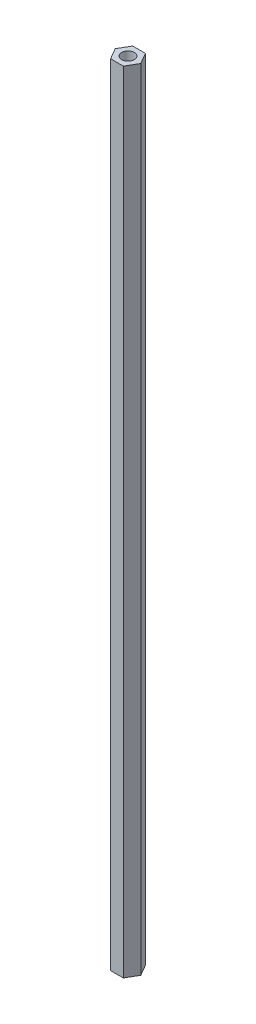
ISO-10303-21;
HEADER;
FILE_DESCRIPTION(('STEP AP214'),'2;1');
FILE_NAME('part.step','',(''),(''),'','','');
FILE_SCHEMA(('AUTOMOTIVE_DESIGN { 1 0 10303 214 1 1 1 1 }'));
ENDSEC;
DATA;
#1=APPLICATION_CONTEXT('core data for automotive mechanical design processes');
#2=APPLICATION_PROTOCOL_DEFINITION('international standard','automotive_design',2000,#1);
#3=PRODUCT_CONTEXT('',#1,'mechanical');
#4=PRODUCT('Part','Part','',(#3));
#5=PRODUCT_RELATED_PRODUCT_CATEGORY('part','',(#4));
#6=PRODUCT_DEFINITION_FORMATION('','',#4);
#7=PRODUCT_DEFINITION_CONTEXT('part definition',#1,'design');
#8=PRODUCT_DEFINITION('design','',#6,#7);
#9=PRODUCT_DEFINITION_SHAPE('','',#8);
#10=(LENGTH_UNIT() NAMED_UNIT(*) SI_UNIT(.MILLI.,.METRE.));
#11=(NAMED_UNIT(*) PLANE_ANGLE_UNIT() SI_UNIT($,.RADIAN.));
#12=(NAMED_UNIT(*) SI_UNIT($,.STERADIAN.) SOLID_ANGLE_UNIT());
#13=UNCERTAINTY_MEASURE_WITH_UNIT(LENGTH_MEASURE(1.E-05),#10,'distance_accuracy_value','');
#14=(GEOMETRIC_REPRESENTATION_CONTEXT(3) GLOBAL_UNCERTAINTY_ASSIGNED_CONTEXT((#13)) GLOBAL_UNIT_ASSIGNED_CONTEXT((#10,
#11,#12)) REPRESENTATION_CONTEXT('',''));
#15=CARTESIAN_POINT('',(0.,0.,0.));
#16=DIRECTION('',(0.,0.,1.));
#17=DIRECTION('',(1.,0.,0.));
#18=AXIS2_PLACEMENT_3D('',#15,#16,#17);
#19=CARTESIAN_POINT('',(0.,250.,0.));
#20=DIRECTION('',(0.,1.,0.));
#21=DIRECTION('',(0.,0.,1.));
#22=AXIS2_PLACEMENT_3D('',#19,#20,#21);
#23=PLANE('',#22);
#24=DIRECTION('',(-0.5,0.,-0.866025403784438));
#25=VECTOR('',#24,1.);
#26=CARTESIAN_POINT('',(4.04145188432738,250.,0.));
#27=LINE('',#26,#25);
#28=CARTESIAN_POINT('',(4.04145188432738,250.,0.));
#29=VERTEX_POINT('',#28);
#30=CARTESIAN_POINT('',(2.02072594216369,250.,-3.5));
#31=VERTEX_POINT('',#30);
#32=EDGE_CURVE('E154',#29,#31,#27,.T.);
#33=ORIENTED_EDGE('',*,*,#32,.T.);
#34=DIRECTION('',(-1.,0.,0.));
#35=VECTOR('',#34,1.);
#36=CARTESIAN_POINT('',(2.02072594216369,250.,-3.5));
#37=LINE('',#36,#35);
#38=CARTESIAN_POINT('',(-2.02072594216369,250.,-3.5));
#39=VERTEX_POINT('',#38);
#40=EDGE_CURVE('E102',#31,#39,#37,.T.);
#41=ORIENTED_EDGE('',*,*,#40,.T.);
#42=DIRECTION('',(-0.5,0.,0.866025403784439));
#43=VECTOR('',#42,1.);
#44=CARTESIAN_POINT('',(-2.02072594216369,250.,-3.5));
#45=LINE('',#44,#43);
#46=CARTESIAN_POINT('',(-4.04145188432738,250.,0.));
#47=VERTEX_POINT('',#46);
#48=EDGE_CURVE('E115',#39,#47,#45,.T.);
#49=ORIENTED_EDGE('',*,*,#48,.T.);
#50=DIRECTION('',(0.5,0.,0.866025403784439));
#51=VECTOR('',#50,1.);
#52=CARTESIAN_POINT('',(-4.04145188432738,250.,0.));
#53=LINE('',#52,#51);
#54=CARTESIAN_POINT('',(-2.02072594216368,250.,3.5));
#55=VERTEX_POINT('',#54);
#56=EDGE_CURVE('E109',#47,#55,#53,.T.);
#57=ORIENTED_EDGE('',*,*,#56,.T.);
#58=DIRECTION('',(1.,0.,0.));
#59=VECTOR('',#58,1.);
#60=CARTESIAN_POINT('',(-2.02072594216368,250.,3.5));
#61=LINE('',#60,#59);
#62=CARTESIAN_POINT('',(2.02072594216369,250.,3.5));
#63=VERTEX_POINT('',#62);
#64=EDGE_CURVE('E113',#55,#63,#61,.T.);
#65=ORIENTED_EDGE('',*,*,#64,.T.);
#66=DIRECTION('',(0.5,0.,-0.866025403784439));
#67=VECTOR('',#66,1.);
#68=CARTESIAN_POINT('',(2.02072594216369,250.,3.5));
#69=LINE('',#68,#67);
#70=EDGE_CURVE('E65',#63,#29,#69,.T.);
#71=ORIENTED_EDGE('',*,*,#70,.T.);
#72=EDGE_LOOP('',(#33,#41,#49,#57,#65,#71));
#73=FACE_BOUND('',#72,.T.);
#74=CARTESIAN_POINT('',(0.,250.,0.));
#75=DIRECTION('',(0.,1.,0.));
#76=DIRECTION('',(0.,0.,1.));
#77=AXIS2_PLACEMENT_3D('',#74,#75,#76);
#78=CIRCLE('',#77,2.);
#79=CARTESIAN_POINT('',(0.,250.,2.));
#80=VERTEX_POINT('',#79);
#81=EDGE_CURVE('E142',#80,#80,#78,.T.);
#82=ORIENTED_EDGE('',*,*,#81,.F.);
#83=EDGE_LOOP('',(#82));
#84=FACE_BOUND('',#83,.T.);
#85=ADVANCED_FACE('F47',(#73,#84),#23,.T.);
#86=CARTESIAN_POINT('',(0.,0.,0.));
#87=DIRECTION('',(0.,1.,0.));
#88=DIRECTION('',(0.,0.,1.));
#89=AXIS2_PLACEMENT_3D('',#86,#87,#88);
#90=PLANE('',#89);
#91=DIRECTION('',(-0.5,0.,-0.866025403784438));
#92=VECTOR('',#91,1.);
#93=CARTESIAN_POINT('',(4.04145188432738,0.,0.));
#94=LINE('',#93,#92);
#95=CARTESIAN_POINT('',(4.04145188432738,0.,0.));
#96=VERTEX_POINT('',#95);
#97=CARTESIAN_POINT('',(2.02072594216369,0.,-3.5));
#98=VERTEX_POINT('',#97);
#99=EDGE_CURVE('E137',#96,#98,#94,.T.);
#100=ORIENTED_EDGE('',*,*,#99,.F.);
#101=DIRECTION('',(0.5,0.,-0.866025403784439));
#102=VECTOR('',#101,1.);
#103=CARTESIAN_POINT('',(2.02072594216369,0.,3.5));
#104=LINE('',#103,#102);
#105=CARTESIAN_POINT('',(2.02072594216369,0.,3.5));
#106=VERTEX_POINT('',#105);
#107=EDGE_CURVE('E94',#106,#96,#104,.T.);
#108=ORIENTED_EDGE('',*,*,#107,.F.);
#109=DIRECTION('',(1.,0.,0.));
#110=VECTOR('',#109,1.);
#111=CARTESIAN_POINT('',(-2.02072594216368,0.,3.5));
#112=LINE('',#111,#110);
#113=CARTESIAN_POINT('',(-2.02072594216368,0.,3.5));
#114=VERTEX_POINT('',#113);
#115=EDGE_CURVE('E88',#114,#106,#112,.T.);
#116=ORIENTED_EDGE('',*,*,#115,.F.);
#117=DIRECTION('',(0.5,0.,0.866025403784439));
#118=VECTOR('',#117,1.);
#119=CARTESIAN_POINT('',(-4.04145188432738,0.,0.));
#120=LINE('',#119,#118);
#121=CARTESIAN_POINT('',(-4.04145188432738,0.,0.));
#122=VERTEX_POINT('',#121);
#123=EDGE_CURVE('E124',#122,#114,#120,.T.);
#124=ORIENTED_EDGE('',*,*,#123,.F.);
#125=DIRECTION('',(-0.5,0.,0.866025403784439));
#126=VECTOR('',#125,1.);
#127=CARTESIAN_POINT('',(-2.02072594216369,0.,-3.5));
#128=LINE('',#127,#126);
#129=CARTESIAN_POINT('',(-2.02072594216369,0.,-3.5));
#130=VERTEX_POINT('',#129);
#131=EDGE_CURVE('E145',#130,#122,#128,.T.);
#132=ORIENTED_EDGE('',*,*,#131,.F.);
#133=DIRECTION('',(-1.,0.,0.));
#134=VECTOR('',#133,1.);
#135=CARTESIAN_POINT('',(2.02072594216369,0.,-3.5));
#136=LINE('',#135,#134);
#137=EDGE_CURVE('E141',#98,#130,#136,.T.);
#138=ORIENTED_EDGE('',*,*,#137,.F.);
#139=EDGE_LOOP('',(#100,#108,#116,#124,#132,#138));
#140=FACE_BOUND('',#139,.T.);
#141=CARTESIAN_POINT('',(0.,0.,0.));
#142=DIRECTION('',(0.,1.,0.));
#143=DIRECTION('',(0.,0.,1.));
#144=AXIS2_PLACEMENT_3D('',#141,#142,#143);
#145=CIRCLE('',#144,2.);
#146=CARTESIAN_POINT('',(0.,0.,2.));
#147=VERTEX_POINT('',#146);
#148=EDGE_CURVE('E253',#147,#147,#145,.T.);
#149=ORIENTED_EDGE('',*,*,#148,.T.);
#150=EDGE_LOOP('',(#149));
#151=FACE_BOUND('',#150,.T.);
#152=ADVANCED_FACE('F167',(#140,#151),#90,.F.);
#153=CARTESIAN_POINT('',(4.04145188432738,250.,0.));
#154=DIRECTION('',(-0.866025403784438,0.,0.5));
#155=DIRECTION('',(0.5,0.,0.866025403784438));
#156=AXIS2_PLACEMENT_3D('',#153,#154,#155);
#157=PLANE('',#156);
#158=ORIENTED_EDGE('',*,*,#99,.T.);
#159=DIRECTION('',(0.,-1.,0.));
#160=VECTOR('',#159,1.);
#161=CARTESIAN_POINT('',(2.02072594216369,250.,-3.5));
#162=LINE('',#161,#160);
#163=EDGE_CURVE('E11',#31,#98,#162,.T.);
#164=ORIENTED_EDGE('',*,*,#163,.F.);
#165=ORIENTED_EDGE('',*,*,#32,.F.);
#166=DIRECTION('',(0.,-1.,0.));
#167=VECTOR('',#166,1.);
#168=CARTESIAN_POINT('',(4.04145188432738,250.,0.));
#169=LINE('',#168,#167);
#170=EDGE_CURVE('E133',#29,#96,#169,.T.);
#171=ORIENTED_EDGE('',*,*,#170,.T.);
#172=EDGE_LOOP('',(#158,#164,#165,#171));
#173=FACE_BOUND('',#172,.T.);
#174=ADVANCED_FACE('F49',(#173),#157,.F.);
#175=CARTESIAN_POINT('',(2.02072594216369,250.,-3.5));
#176=DIRECTION('',(0.,0.,1.));
#177=DIRECTION('',(1.,0.,0.));
#178=AXIS2_PLACEMENT_3D('',#175,#176,#177);
#179=PLANE('',#178);
#180=ORIENTED_EDGE('',*,*,#137,.T.);
#181=DIRECTION('',(0.,-1.,0.));
#182=VECTOR('',#181,1.);
#183=CARTESIAN_POINT('',(-2.02072594216369,250.,-3.5));
#184=LINE('',#183,#182);
#185=EDGE_CURVE('E57',#39,#130,#184,.T.);
#186=ORIENTED_EDGE('',*,*,#185,.F.);
#187=ORIENTED_EDGE('',*,*,#40,.F.);
#188=ORIENTED_EDGE('',*,*,#163,.T.);
#189=EDGE_LOOP('',(#180,#186,#187,#188));
#190=FACE_BOUND('',#189,.T.);
#191=ADVANCED_FACE('F192',(#190),#179,.F.);
#192=CARTESIAN_POINT('',(-2.02072594216369,250.,-3.5));
#193=DIRECTION('',(0.866025403784439,0.,0.5));
#194=DIRECTION('',(0.5,0.,-0.866025403784439));
#195=AXIS2_PLACEMENT_3D('',#192,#193,#194);
#196=PLANE('',#195);
#197=ORIENTED_EDGE('',*,*,#131,.T.);
#198=DIRECTION('',(0.,-1.,0.));
#199=VECTOR('',#198,1.);
#200=CARTESIAN_POINT('',(-4.04145188432738,250.,0.));
#201=LINE('',#200,#199);
#202=EDGE_CURVE('E126',#47,#122,#201,.T.);
#203=ORIENTED_EDGE('',*,*,#202,.F.);
#204=ORIENTED_EDGE('',*,*,#48,.F.);
#205=ORIENTED_EDGE('',*,*,#185,.T.);
#206=EDGE_LOOP('',(#197,#203,#204,#205));
#207=FACE_BOUND('',#206,.T.);
#208=ADVANCED_FACE('F164',(#207),#196,.F.);
#209=CARTESIAN_POINT('',(-4.04145188432738,250.,0.));
#210=DIRECTION('',(0.866025403784439,0.,-0.5));
#211=DIRECTION('',(-0.5,0.,-0.866025403784439));
#212=AXIS2_PLACEMENT_3D('',#209,#210,#211);
#213=PLANE('',#212);
#214=ORIENTED_EDGE('',*,*,#123,.T.);
#215=DIRECTION('',(0.,-1.,0.));
#216=VECTOR('',#215,1.);
#217=CARTESIAN_POINT('',(-2.02072594216368,250.,3.5));
#218=LINE('',#217,#216);
#219=EDGE_CURVE('E121',#55,#114,#218,.T.);
#220=ORIENTED_EDGE('',*,*,#219,.F.);
#221=ORIENTED_EDGE('',*,*,#56,.F.);
#222=ORIENTED_EDGE('',*,*,#202,.T.);
#223=EDGE_LOOP('',(#214,#220,#221,#222));
#224=FACE_BOUND('',#223,.T.);
#225=ADVANCED_FACE('F122',(#224),#213,.F.);
#226=CARTESIAN_POINT('',(-2.02072594216368,250.,3.5));
#227=DIRECTION('',(0.,0.,-1.));
#228=DIRECTION('',(-1.,0.,0.));
#229=AXIS2_PLACEMENT_3D('',#226,#227,#228);
#230=PLANE('',#229);
#231=ORIENTED_EDGE('',*,*,#115,.T.);
#232=DIRECTION('',(0.,-1.,0.));
#233=VECTOR('',#232,1.);
#234=CARTESIAN_POINT('',(2.02072594216369,250.,3.5));
#235=LINE('',#234,#233);
#236=EDGE_CURVE('E127',#63,#106,#235,.T.);
#237=ORIENTED_EDGE('',*,*,#236,.F.);
#238=ORIENTED_EDGE('',*,*,#64,.F.);
#239=ORIENTED_EDGE('',*,*,#219,.T.);
#240=EDGE_LOOP('',(#231,#237,#238,#239));
#241=FACE_BOUND('',#240,.T.);
#242=ADVANCED_FACE('F129',(#241),#230,.F.);
#243=CARTESIAN_POINT('',(2.02072594216369,250.,3.5));
#244=DIRECTION('',(-0.866025403784439,0.,-0.5));
#245=DIRECTION('',(-0.5,0.,0.866025403784439));
#246=AXIS2_PLACEMENT_3D('',#243,#244,#245);
#247=PLANE('',#246);
#248=ORIENTED_EDGE('',*,*,#107,.T.);
#249=ORIENTED_EDGE('',*,*,#170,.F.);
#250=ORIENTED_EDGE('',*,*,#70,.F.);
#251=ORIENTED_EDGE('',*,*,#236,.T.);
#252=EDGE_LOOP('',(#248,#249,#250,#251));
#253=FACE_BOUND('',#252,.T.);
#254=ADVANCED_FACE('F172',(#253),#247,.F.);
#255=CARTESIAN_POINT('',(0.,250.,0.));
#256=DIRECTION('',(0.,-1.,0.));
#257=DIRECTION('',(0.,0.,-1.));
#258=AXIS2_PLACEMENT_3D('',#255,#256,#257);
#259=CYLINDRICAL_SURFACE('',#258,2.);
#260=ORIENTED_EDGE('',*,*,#81,.T.);
#261=EDGE_LOOP('',(#260));
#262=FACE_BOUND('',#261,.T.);
#263=ORIENTED_EDGE('',*,*,#148,.F.);
#264=EDGE_LOOP('',(#263));
#265=FACE_BOUND('',#264,.T.);
#266=ADVANCED_FACE('F174',(#262,#265),#259,.F.);
#267=CLOSED_SHELL('',(#85,#152,#174,#191,#208,#225,#242,#254,#266));
#268=MANIFOLD_SOLID_BREP('B2',#267);
#269=ADVANCED_BREP_SHAPE_REPRESENTATION('',(#18,#268),#14);
#270=SHAPE_DEFINITION_REPRESENTATION(#9,#269);
ENDSEC;
END-ISO-10303-21;
